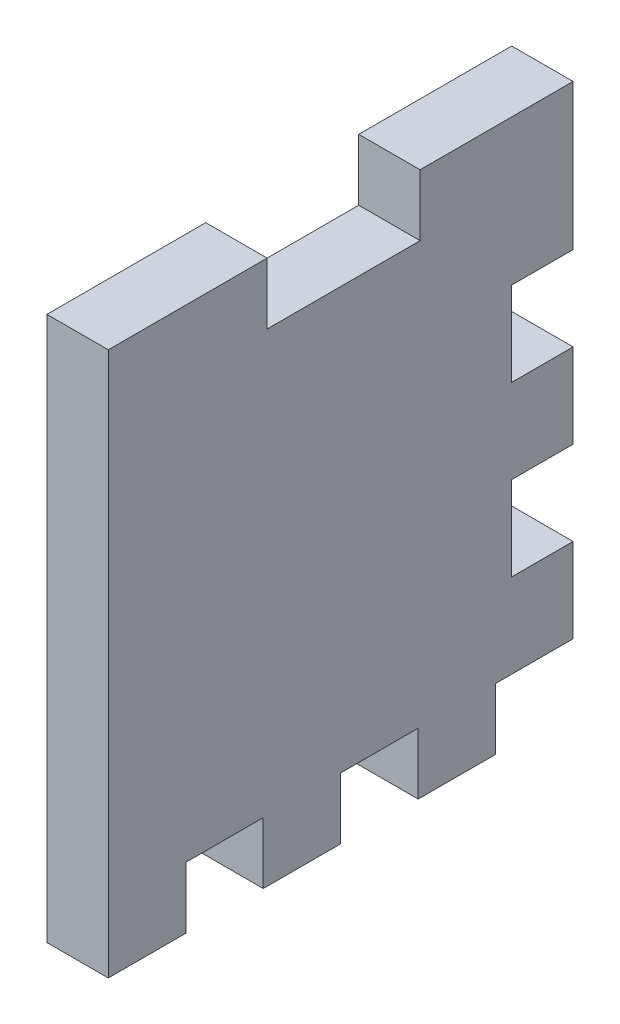
ISO-10303-21;
HEADER;
FILE_DESCRIPTION(('STEP AP214'),'2;1');
FILE_NAME('part.step','',(''),(''),'','','');
FILE_SCHEMA(('AUTOMOTIVE_DESIGN { 1 0 10303 214 1 1 1 1 }'));
ENDSEC;
DATA;
#1=APPLICATION_CONTEXT('core data for automotive mechanical design processes');
#2=APPLICATION_PROTOCOL_DEFINITION('international standard','automotive_design',2000,#1);
#3=PRODUCT_CONTEXT('',#1,'mechanical');
#4=PRODUCT('Part','Part','',(#3));
#5=PRODUCT_RELATED_PRODUCT_CATEGORY('part','',(#4));
#6=PRODUCT_DEFINITION_FORMATION('','',#4);
#7=PRODUCT_DEFINITION_CONTEXT('part definition',#1,'design');
#8=PRODUCT_DEFINITION('design','',#6,#7);
#9=PRODUCT_DEFINITION_SHAPE('','',#8);
#10=(LENGTH_UNIT() NAMED_UNIT(*) SI_UNIT(.MILLI.,.METRE.));
#11=(NAMED_UNIT(*) PLANE_ANGLE_UNIT() SI_UNIT($,.RADIAN.));
#12=(NAMED_UNIT(*) SI_UNIT($,.STERADIAN.) SOLID_ANGLE_UNIT());
#13=UNCERTAINTY_MEASURE_WITH_UNIT(LENGTH_MEASURE(1.E-05),#10,'distance_accuracy_value','');
#14=(GEOMETRIC_REPRESENTATION_CONTEXT(3) GLOBAL_UNCERTAINTY_ASSIGNED_CONTEXT((#13)) GLOBAL_UNIT_ASSIGNED_CONTEXT((#10,
#11,#12)) REPRESENTATION_CONTEXT('',''));
#15=CARTESIAN_POINT('',(0.,0.,0.));
#16=DIRECTION('',(0.,0.,1.));
#17=DIRECTION('',(1.,0.,0.));
#18=AXIS2_PLACEMENT_3D('',#15,#16,#17);
#19=CARTESIAN_POINT('',(2.667,20.9677,20.193));
#20=DIRECTION('',(0.,-1.,0.));
#21=DIRECTION('',(0.,0.,-1.));
#22=AXIS2_PLACEMENT_3D('',#19,#20,#21);
#23=PLANE('',#22);
#24=DIRECTION('',(0.,0.,1.));
#25=VECTOR('',#24,1.);
#26=CARTESIAN_POINT('',(2.667,20.9677,20.193));
#27=LINE('',#26,#25);
#28=CARTESIAN_POINT('',(2.667,20.9677,6.39233333333333));
#29=VERTEX_POINT('',#28);
#30=CARTESIAN_POINT('',(2.667,20.9677,20.193));
#31=VERTEX_POINT('',#30);
#32=EDGE_CURVE('E37',#29,#31,#27,.T.);
#33=ORIENTED_EDGE('',*,*,#32,.F.);
#34=DIRECTION('',(1.,0.,0.));
#35=VECTOR('',#34,1.);
#36=CARTESIAN_POINT('',(2.667,20.9677,6.39233333333333));
#37=LINE('',#36,#35);
#38=CARTESIAN_POINT('',(-2.667,20.9677,6.39233333333333));
#39=VERTEX_POINT('',#38);
#40=EDGE_CURVE('E227',#39,#29,#37,.T.);
#41=ORIENTED_EDGE('',*,*,#40,.F.);
#42=DIRECTION('',(0.,0.,1.));
#43=VECTOR('',#42,1.);
#44=CARTESIAN_POINT('',(-2.667,20.9677,20.193));
#45=LINE('',#44,#43);
#46=CARTESIAN_POINT('',(-2.667,20.9677,20.193));
#47=VERTEX_POINT('',#46);
#48=EDGE_CURVE('E422',#39,#47,#45,.T.);
#49=ORIENTED_EDGE('',*,*,#48,.T.);
#50=DIRECTION('',(-1.,0.,0.));
#51=VECTOR('',#50,1.);
#52=CARTESIAN_POINT('',(2.667,20.9677,20.193));
#53=LINE('',#52,#51);
#54=EDGE_CURVE('E43',#31,#47,#53,.T.);
#55=ORIENTED_EDGE('',*,*,#54,.F.);
#56=EDGE_LOOP('',(#33,#41,#49,#55));
#57=FACE_BOUND('',#56,.T.);
#58=ADVANCED_FACE('F33',(#57),#23,.F.);
#59=CARTESIAN_POINT('',(2.667,-20.9677,-20.193));
#60=DIRECTION('',(0.,0.,1.));
#61=DIRECTION('',(1.,0.,0.));
#62=AXIS2_PLACEMENT_3D('',#59,#60,#61);
#63=PLANE('',#62);
#64=DIRECTION('',(0.,1.,0.));
#65=VECTOR('',#64,1.);
#66=CARTESIAN_POINT('',(-2.667,-20.9677,-20.193));
#67=LINE('',#66,#65);
#68=CARTESIAN_POINT('',(-2.66699999999999,-6.32714000000001,-20.193));
#69=VERTEX_POINT('',#68);
#70=CARTESIAN_POINT('',(-2.667,0.993139999999993,-20.193));
#71=VERTEX_POINT('',#70);
#72=EDGE_CURVE('E423',#69,#71,#67,.T.);
#73=ORIENTED_EDGE('',*,*,#72,.T.);
#74=DIRECTION('',(1.,0.,0.));
#75=VECTOR('',#74,1.);
#76=CARTESIAN_POINT('',(2.667,0.993139999999994,-20.193));
#77=LINE('',#76,#75);
#78=CARTESIAN_POINT('',(2.667,0.993139999999994,-20.193));
#79=VERTEX_POINT('',#78);
#80=EDGE_CURVE('E293',#71,#79,#77,.T.);
#81=ORIENTED_EDGE('',*,*,#80,.T.);
#82=DIRECTION('',(0.,1.,0.));
#83=VECTOR('',#82,1.);
#84=CARTESIAN_POINT('',(2.667,-20.9677,-20.193));
#85=LINE('',#84,#83);
#86=CARTESIAN_POINT('',(2.66700000000001,-6.32714,-20.193));
#87=VERTEX_POINT('',#86);
#88=EDGE_CURVE('E412',#87,#79,#85,.T.);
#89=ORIENTED_EDGE('',*,*,#88,.F.);
#90=DIRECTION('',(-1.,0.,0.));
#91=VECTOR('',#90,1.);
#92=CARTESIAN_POINT('',(2.667,-6.32714,-20.193));
#93=LINE('',#92,#91);
#94=EDGE_CURVE('E254',#87,#69,#93,.T.);
#95=ORIENTED_EDGE('',*,*,#94,.T.);
#96=EDGE_LOOP('',(#73,#81,#89,#95));
#97=FACE_BOUND('',#96,.T.);
#98=ADVANCED_FACE('F471',(#97),#63,.F.);
#99=CARTESIAN_POINT('',(-2.667,-20.9677,-20.193));
#100=VERTEX_POINT('',#99);
#101=CARTESIAN_POINT('',(-2.66699999999999,-13.64742,-20.193));
#102=VERTEX_POINT('',#101);
#103=EDGE_CURVE('E418',#100,#102,#67,.T.);
#104=ORIENTED_EDGE('',*,*,#103,.T.);
#105=DIRECTION('',(1.,0.,0.));
#106=VECTOR('',#105,1.);
#107=CARTESIAN_POINT('',(2.667,-13.64742,-20.193));
#108=LINE('',#107,#106);
#109=CARTESIAN_POINT('',(2.667,-13.64742,-20.193));
#110=VERTEX_POINT('',#109);
#111=EDGE_CURVE('E257',#102,#110,#108,.T.);
#112=ORIENTED_EDGE('',*,*,#111,.T.);
#113=CARTESIAN_POINT('',(2.667,-20.9677,-20.193));
#114=VERTEX_POINT('',#113);
#115=EDGE_CURVE('E449',#114,#110,#85,.T.);
#116=ORIENTED_EDGE('',*,*,#115,.F.);
#117=DIRECTION('',(-1.,0.,0.));
#118=VECTOR('',#117,1.);
#119=CARTESIAN_POINT('',(2.667,-20.9677,-20.193));
#120=LINE('',#119,#118);
#121=EDGE_CURVE('E404',#114,#100,#120,.T.);
#122=ORIENTED_EDGE('',*,*,#121,.T.);
#123=EDGE_LOOP('',(#104,#112,#116,#122));
#124=FACE_BOUND('',#123,.T.);
#125=ADVANCED_FACE('F477',(#124),#63,.F.);
#126=CARTESIAN_POINT('',(2.667,-20.9677,20.193));
#127=DIRECTION('',(0.,1.,0.));
#128=DIRECTION('',(0.,0.,1.));
#129=AXIS2_PLACEMENT_3D('',#126,#127,#128);
#130=PLANE('',#129);
#131=DIRECTION('',(0.,0.,-1.));
#132=VECTOR('',#131,1.);
#133=CARTESIAN_POINT('',(-2.667,-20.9677,20.193));
#134=LINE('',#133,#132);
#135=CARTESIAN_POINT('',(-2.667,-20.9677,0.));
#136=VERTEX_POINT('',#135);
#137=CARTESIAN_POINT('',(-2.667,-20.9677,-6.731));
#138=VERTEX_POINT('',#137);
#139=EDGE_CURVE('E392',#136,#138,#134,.T.);
#140=ORIENTED_EDGE('',*,*,#139,.T.);
#141=DIRECTION('',(1.,0.,0.));
#142=VECTOR('',#141,1.);
#143=CARTESIAN_POINT('',(-2.667,-20.9677,-6.731));
#144=LINE('',#143,#142);
#145=CARTESIAN_POINT('',(2.667,-20.9677,-6.731));
#146=VERTEX_POINT('',#145);
#147=EDGE_CURVE('E327',#138,#146,#144,.T.);
#148=ORIENTED_EDGE('',*,*,#147,.T.);
#149=DIRECTION('',(0.,0.,-1.));
#150=VECTOR('',#149,1.);
#151=CARTESIAN_POINT('',(2.667,-20.9677,20.193));
#152=LINE('',#151,#150);
#153=CARTESIAN_POINT('',(2.667,-20.9677,0.));
#154=VERTEX_POINT('',#153);
#155=EDGE_CURVE('E397',#154,#146,#152,.T.);
#156=ORIENTED_EDGE('',*,*,#155,.F.);
#157=DIRECTION('',(1.,0.,0.));
#158=VECTOR('',#157,1.);
#159=CARTESIAN_POINT('',(-2.667,-20.9677,0.));
#160=LINE('',#159,#158);
#161=EDGE_CURVE('E357',#136,#154,#160,.T.);
#162=ORIENTED_EDGE('',*,*,#161,.F.);
#163=EDGE_LOOP('',(#140,#148,#156,#162));
#164=FACE_BOUND('',#163,.T.);
#165=ADVANCED_FACE('F493',(#164),#130,.F.);
#166=CARTESIAN_POINT('',(-2.667,-20.9677,13.462));
#167=VERTEX_POINT('',#166);
#168=CARTESIAN_POINT('',(-2.667,-20.9677,6.731));
#169=VERTEX_POINT('',#168);
#170=EDGE_CURVE('E395',#167,#169,#134,.T.);
#171=ORIENTED_EDGE('',*,*,#170,.T.);
#172=DIRECTION('',(1.,0.,0.));
#173=VECTOR('',#172,1.);
#174=CARTESIAN_POINT('',(-2.667,-20.9677,6.731));
#175=LINE('',#174,#173);
#176=CARTESIAN_POINT('',(2.667,-20.9677,6.731));
#177=VERTEX_POINT('',#176);
#178=EDGE_CURVE('E354',#169,#177,#175,.T.);
#179=ORIENTED_EDGE('',*,*,#178,.T.);
#180=CARTESIAN_POINT('',(2.667,-20.9677,13.462));
#181=VERTEX_POINT('',#180);
#182=EDGE_CURVE('E380',#181,#177,#152,.T.);
#183=ORIENTED_EDGE('',*,*,#182,.F.);
#184=DIRECTION('',(1.,0.,0.));
#185=VECTOR('',#184,1.);
#186=CARTESIAN_POINT('',(-2.667,-20.9677,13.462));
#187=LINE('',#186,#185);
#188=EDGE_CURVE('E375',#167,#181,#187,.T.);
#189=ORIENTED_EDGE('',*,*,#188,.F.);
#190=EDGE_LOOP('',(#171,#179,#183,#189));
#191=FACE_BOUND('',#190,.T.);
#192=ADVANCED_FACE('F490',(#191),#130,.F.);
#193=CARTESIAN_POINT('',(2.667,-20.9677,-13.462));
#194=VERTEX_POINT('',#193);
#195=EDGE_CURVE('E409',#194,#114,#152,.T.);
#196=ORIENTED_EDGE('',*,*,#195,.F.);
#197=DIRECTION('',(1.,0.,0.));
#198=VECTOR('',#197,1.);
#199=CARTESIAN_POINT('',(-2.667,-20.9677,-13.462));
#200=LINE('',#199,#198);
#201=CARTESIAN_POINT('',(-2.667,-20.9677,-13.462));
#202=VERTEX_POINT('',#201);
#203=EDGE_CURVE('E330',#202,#194,#200,.T.);
#204=ORIENTED_EDGE('',*,*,#203,.F.);
#205=EDGE_CURVE('E396',#202,#100,#134,.T.);
#206=ORIENTED_EDGE('',*,*,#205,.T.);
#207=ORIENTED_EDGE('',*,*,#121,.F.);
#208=EDGE_LOOP('',(#196,#204,#206,#207));
#209=FACE_BOUND('',#208,.T.);
#210=ADVANCED_FACE('F485',(#209),#130,.F.);
#211=CARTESIAN_POINT('',(2.667,8.31342,-20.193));
#212=VERTEX_POINT('',#211);
#213=CARTESIAN_POINT('',(2.667,20.9677,-20.193));
#214=VERTEX_POINT('',#213);
#215=EDGE_CURVE('E454',#212,#214,#85,.T.);
#216=ORIENTED_EDGE('',*,*,#215,.F.);
#217=DIRECTION('',(-1.,0.,0.));
#218=VECTOR('',#217,1.);
#219=CARTESIAN_POINT('',(2.667,8.31342,-20.193));
#220=LINE('',#219,#218);
#221=CARTESIAN_POINT('',(-2.667,8.31342,-20.193));
#222=VERTEX_POINT('',#221);
#223=EDGE_CURVE('E297',#212,#222,#220,.T.);
#224=ORIENTED_EDGE('',*,*,#223,.T.);
#225=CARTESIAN_POINT('',(-2.667,20.9677,-20.193));
#226=VERTEX_POINT('',#225);
#227=EDGE_CURVE('E379',#222,#226,#67,.T.);
#228=ORIENTED_EDGE('',*,*,#227,.T.);
#229=DIRECTION('',(-1.,0.,0.));
#230=VECTOR('',#229,1.);
#231=CARTESIAN_POINT('',(2.667,20.9677,-20.193));
#232=LINE('',#231,#230);
#233=EDGE_CURVE('E11',#214,#226,#232,.T.);
#234=ORIENTED_EDGE('',*,*,#233,.F.);
#235=EDGE_LOOP('',(#216,#224,#228,#234));
#236=FACE_BOUND('',#235,.T.);
#237=ADVANCED_FACE('F35',(#236),#63,.F.);
#238=CARTESIAN_POINT('',(-2.667,20.9677,-6.90033333333333));
#239=VERTEX_POINT('',#238);
#240=EDGE_CURVE('E424',#226,#239,#45,.T.);
#241=ORIENTED_EDGE('',*,*,#240,.T.);
#242=DIRECTION('',(-1.,0.,0.));
#243=VECTOR('',#242,1.);
#244=CARTESIAN_POINT('',(2.667,20.9677,-6.90033333333333));
#245=LINE('',#244,#243);
#246=CARTESIAN_POINT('',(2.667,20.9677,-6.90033333333333));
#247=VERTEX_POINT('',#246);
#248=EDGE_CURVE('E51',#247,#239,#245,.T.);
#249=ORIENTED_EDGE('',*,*,#248,.F.);
#250=EDGE_CURVE('E232',#214,#247,#27,.T.);
#251=ORIENTED_EDGE('',*,*,#250,.F.);
#252=ORIENTED_EDGE('',*,*,#233,.T.);
#253=EDGE_LOOP('',(#241,#249,#251,#252));
#254=FACE_BOUND('',#253,.T.);
#255=ADVANCED_FACE('F472',(#254),#23,.F.);
#256=CARTESIAN_POINT('',(2.667,-20.9677,20.193));
#257=DIRECTION('',(0.,0.,-1.));
#258=DIRECTION('',(-1.,0.,0.));
#259=AXIS2_PLACEMENT_3D('',#256,#257,#258);
#260=PLANE('',#259);
#261=DIRECTION('',(0.,-1.,0.));
#262=VECTOR('',#261,1.);
#263=CARTESIAN_POINT('',(-2.667,-20.9677,20.193));
#264=LINE('',#263,#262);
#265=CARTESIAN_POINT('',(-2.667,-26.3017,20.193));
#266=VERTEX_POINT('',#265);
#267=EDGE_CURVE('E402',#47,#266,#264,.T.);
#268=ORIENTED_EDGE('',*,*,#267,.T.);
#269=DIRECTION('',(1.,0.,0.));
#270=VECTOR('',#269,1.);
#271=CARTESIAN_POINT('',(-2.667,-26.3017,20.193));
#272=LINE('',#271,#270);
#273=CARTESIAN_POINT('',(2.667,-26.3017,20.193));
#274=VERTEX_POINT('',#273);
#275=EDGE_CURVE('E389',#266,#274,#272,.T.);
#276=ORIENTED_EDGE('',*,*,#275,.T.);
#277=DIRECTION('',(0.,-1.,0.));
#278=VECTOR('',#277,1.);
#279=CARTESIAN_POINT('',(2.667,-20.9677,20.193));
#280=LINE('',#279,#278);
#281=EDGE_CURVE('E411',#31,#274,#280,.T.);
#282=ORIENTED_EDGE('',*,*,#281,.F.);
#283=ORIENTED_EDGE('',*,*,#54,.T.);
#284=EDGE_LOOP('',(#268,#276,#282,#283));
#285=FACE_BOUND('',#284,.T.);
#286=ADVANCED_FACE('F438',(#285),#260,.F.);
#287=CARTESIAN_POINT('',(2.667,20.9677,-20.193));
#288=DIRECTION('',(-1.,0.,0.));
#289=DIRECTION('',(0.,0.,1.));
#290=AXIS2_PLACEMENT_3D('',#287,#288,#289);
#291=PLANE('',#290);
#292=ORIENTED_EDGE('',*,*,#32,.T.);
#293=ORIENTED_EDGE('',*,*,#281,.T.);
#294=DIRECTION('',(0.,0.,-1.));
#295=VECTOR('',#294,1.);
#296=CARTESIAN_POINT('',(2.667,-26.3017,20.193));
#297=LINE('',#296,#295);
#298=CARTESIAN_POINT('',(2.667,-26.3017,13.462));
#299=VERTEX_POINT('',#298);
#300=EDGE_CURVE('E356',#274,#299,#297,.T.);
#301=ORIENTED_EDGE('',*,*,#300,.T.);
#302=DIRECTION('',(0.,1.,0.));
#303=VECTOR('',#302,1.);
#304=CARTESIAN_POINT('',(2.667,-20.9677,13.462));
#305=LINE('',#304,#303);
#306=EDGE_CURVE('E367',#299,#181,#305,.T.);
#307=ORIENTED_EDGE('',*,*,#306,.T.);
#308=ORIENTED_EDGE('',*,*,#182,.T.);
#309=DIRECTION('',(0.,-1.,0.));
#310=VECTOR('',#309,1.);
#311=CARTESIAN_POINT('',(2.667,-20.9677,6.731));
#312=LINE('',#311,#310);
#313=CARTESIAN_POINT('',(2.667,-26.3017,6.731));
#314=VERTEX_POINT('',#313);
#315=EDGE_CURVE('E329',#177,#314,#312,.T.);
#316=ORIENTED_EDGE('',*,*,#315,.T.);
#317=DIRECTION('',(0.,0.,-1.));
#318=VECTOR('',#317,1.);
#319=CARTESIAN_POINT('',(2.667,-26.3017,6.731));
#320=LINE('',#319,#318);
#321=CARTESIAN_POINT('',(2.667,-26.3017,0.));
#322=VERTEX_POINT('',#321);
#323=EDGE_CURVE('E349',#314,#322,#320,.T.);
#324=ORIENTED_EDGE('',*,*,#323,.T.);
#325=DIRECTION('',(0.,1.,0.));
#326=VECTOR('',#325,1.);
#327=CARTESIAN_POINT('',(2.667,-20.9677,0.));
#328=LINE('',#327,#326);
#329=EDGE_CURVE('E340',#322,#154,#328,.T.);
#330=ORIENTED_EDGE('',*,*,#329,.T.);
#331=ORIENTED_EDGE('',*,*,#155,.T.);
#332=DIRECTION('',(0.,-1.,0.));
#333=VECTOR('',#332,1.);
#334=CARTESIAN_POINT('',(2.667,-20.9677,-6.731));
#335=LINE('',#334,#333);
#336=CARTESIAN_POINT('',(2.667,-26.3017,-6.731));
#337=VERTEX_POINT('',#336);
#338=EDGE_CURVE('E308',#146,#337,#335,.T.);
#339=ORIENTED_EDGE('',*,*,#338,.T.);
#340=DIRECTION('',(0.,0.,-1.));
#341=VECTOR('',#340,1.);
#342=CARTESIAN_POINT('',(2.667,-26.3017,-6.731));
#343=LINE('',#342,#341);
#344=CARTESIAN_POINT('',(2.667,-26.3017,-13.462));
#345=VERTEX_POINT('',#344);
#346=EDGE_CURVE('E322',#337,#345,#343,.T.);
#347=ORIENTED_EDGE('',*,*,#346,.T.);
#348=DIRECTION('',(0.,1.,0.));
#349=VECTOR('',#348,1.);
#350=CARTESIAN_POINT('',(2.667,-20.9677,-13.462));
#351=LINE('',#350,#349);
#352=EDGE_CURVE('E313',#345,#194,#351,.T.);
#353=ORIENTED_EDGE('',*,*,#352,.T.);
#354=ORIENTED_EDGE('',*,*,#195,.T.);
#355=ORIENTED_EDGE('',*,*,#115,.T.);
#356=DIRECTION('',(0.,0.,1.));
#357=VECTOR('',#356,1.);
#358=CARTESIAN_POINT('',(2.667,-13.64742,-20.193));
#359=LINE('',#358,#357);
#360=CARTESIAN_POINT('',(2.667,-13.64742,-14.859));
#361=VERTEX_POINT('',#360);
#362=EDGE_CURVE('E268',#110,#361,#359,.T.);
#363=ORIENTED_EDGE('',*,*,#362,.T.);
#364=DIRECTION('',(0.,-1.,0.));
#365=VECTOR('',#364,1.);
#366=CARTESIAN_POINT('',(2.667,20.9677,-14.859));
#367=LINE('',#366,#365);
#368=CARTESIAN_POINT('',(2.66700000000001,-6.32714,-14.859));
#369=VERTEX_POINT('',#368);
#370=EDGE_CURVE('E290',#369,#361,#367,.T.);
#371=ORIENTED_EDGE('',*,*,#370,.F.);
#372=DIRECTION('',(0.,0.,1.));
#373=VECTOR('',#372,1.);
#374=CARTESIAN_POINT('',(2.667,-6.32714,-20.193));
#375=LINE('',#374,#373);
#376=EDGE_CURVE('E261',#87,#369,#375,.T.);
#377=ORIENTED_EDGE('',*,*,#376,.F.);
#378=ORIENTED_EDGE('',*,*,#88,.T.);
#379=DIRECTION('',(0.,0.,1.));
#380=VECTOR('',#379,1.);
#381=CARTESIAN_POINT('',(2.667,0.993139999999994,-20.193));
#382=LINE('',#381,#380);
#383=CARTESIAN_POINT('',(2.667,0.993139999999994,-14.859));
#384=VERTEX_POINT('',#383);
#385=EDGE_CURVE('E286',#79,#384,#382,.T.);
#386=ORIENTED_EDGE('',*,*,#385,.T.);
#387=CARTESIAN_POINT('',(2.667,8.31342,-14.859));
#388=VERTEX_POINT('',#387);
#389=EDGE_CURVE('E306',#388,#384,#367,.T.);
#390=ORIENTED_EDGE('',*,*,#389,.F.);
#391=DIRECTION('',(0.,0.,1.));
#392=VECTOR('',#391,1.);
#393=CARTESIAN_POINT('',(2.667,8.31342,-20.193));
#394=LINE('',#393,#392);
#395=EDGE_CURVE('E296',#212,#388,#394,.T.);
#396=ORIENTED_EDGE('',*,*,#395,.F.);
#397=ORIENTED_EDGE('',*,*,#215,.T.);
#398=ORIENTED_EDGE('',*,*,#250,.T.);
#399=DIRECTION('',(0.,1.,0.));
#400=VECTOR('',#399,1.);
#401=CARTESIAN_POINT('',(2.667,15.6337,-6.90033333333333));
#402=LINE('',#401,#400);
#403=CARTESIAN_POINT('',(2.667,15.6337,-6.90033333333333));
#404=VERTEX_POINT('',#403);
#405=EDGE_CURVE('E224',#404,#247,#402,.T.);
#406=ORIENTED_EDGE('',*,*,#405,.F.);
#407=DIRECTION('',(0.,0.,1.));
#408=VECTOR('',#407,1.);
#409=CARTESIAN_POINT('',(2.667,15.6337,-20.193));
#410=LINE('',#409,#408);
#411=CARTESIAN_POINT('',(2.667,15.6337,6.39233333333333));
#412=VERTEX_POINT('',#411);
#413=EDGE_CURVE('E209',#404,#412,#410,.T.);
#414=ORIENTED_EDGE('',*,*,#413,.T.);
#415=DIRECTION('',(0.,1.,0.));
#416=VECTOR('',#415,1.);
#417=CARTESIAN_POINT('',(2.667,15.6337,6.39233333333333));
#418=LINE('',#417,#416);
#419=EDGE_CURVE('E221',#412,#29,#418,.T.);
#420=ORIENTED_EDGE('',*,*,#419,.T.);
#421=EDGE_LOOP('',(#292,#293,#301,#307,#308,#316,#324,#330,#331,#339,#347,#353,#354,#355,#363,
#371,#377,#378,#386,#390,#396,#397,#398,#406,#414,#420));
#422=FACE_BOUND('',#421,.T.);
#423=ADVANCED_FACE('F230',(#422),#291,.F.);
#424=CARTESIAN_POINT('',(-2.667,20.9677,-20.193));
#425=DIRECTION('',(-1.,0.,0.));
#426=DIRECTION('',(0.,0.,1.));
#427=AXIS2_PLACEMENT_3D('',#424,#425,#426);
#428=PLANE('',#427);
#429=DIRECTION('',(0.,1.,0.));
#430=VECTOR('',#429,1.);
#431=CARTESIAN_POINT('',(-2.667,15.6337,6.39233333333333));
#432=LINE('',#431,#430);
#433=CARTESIAN_POINT('',(-2.667,15.6337,6.39233333333333));
#434=VERTEX_POINT('',#433);
#435=EDGE_CURVE('E234',#434,#39,#432,.T.);
#436=ORIENTED_EDGE('',*,*,#435,.F.);
#437=DIRECTION('',(0.,0.,1.));
#438=VECTOR('',#437,1.);
#439=CARTESIAN_POINT('',(-2.667,15.6337,-6.90033333333333));
#440=LINE('',#439,#438);
#441=CARTESIAN_POINT('',(-2.667,15.6337,-6.90033333333333));
#442=VERTEX_POINT('',#441);
#443=EDGE_CURVE('E226',#442,#434,#440,.T.);
#444=ORIENTED_EDGE('',*,*,#443,.F.);
#445=DIRECTION('',(0.,1.,0.));
#446=VECTOR('',#445,1.);
#447=CARTESIAN_POINT('',(-2.667,15.6337,-6.90033333333333));
#448=LINE('',#447,#446);
#449=EDGE_CURVE('E225',#442,#239,#448,.T.);
#450=ORIENTED_EDGE('',*,*,#449,.T.);
#451=ORIENTED_EDGE('',*,*,#240,.F.);
#452=ORIENTED_EDGE('',*,*,#227,.F.);
#453=DIRECTION('',(0.,0.,1.));
#454=VECTOR('',#453,1.);
#455=CARTESIAN_POINT('',(-2.667,8.31342,-20.193));
#456=LINE('',#455,#454);
#457=CARTESIAN_POINT('',(-2.667,8.31342,-14.859));
#458=VERTEX_POINT('',#457);
#459=EDGE_CURVE('E797',#222,#458,#456,.T.);
#460=ORIENTED_EDGE('',*,*,#459,.T.);
#461=DIRECTION('',(0.,-1.,0.));
#462=VECTOR('',#461,1.);
#463=CARTESIAN_POINT('',(-2.667,8.31342,-14.859));
#464=LINE('',#463,#462);
#465=CARTESIAN_POINT('',(-2.667,0.993139999999993,-14.859));
#466=VERTEX_POINT('',#465);
#467=EDGE_CURVE('E277',#458,#466,#464,.T.);
#468=ORIENTED_EDGE('',*,*,#467,.T.);
#469=DIRECTION('',(0.,0.,1.));
#470=VECTOR('',#469,1.);
#471=CARTESIAN_POINT('',(-2.667,0.993139999999993,-20.193));
#472=LINE('',#471,#470);
#473=EDGE_CURVE('E283',#71,#466,#472,.T.);
#474=ORIENTED_EDGE('',*,*,#473,.F.);
#475=ORIENTED_EDGE('',*,*,#72,.F.);
#476=DIRECTION('',(0.,0.,1.));
#477=VECTOR('',#476,1.);
#478=CARTESIAN_POINT('',(-2.66699999999999,-6.32714000000001,-20.193));
#479=LINE('',#478,#477);
#480=CARTESIAN_POINT('',(-2.667,-6.32714,-14.859));
#481=VERTEX_POINT('',#480);
#482=EDGE_CURVE('E273',#69,#481,#479,.T.);
#483=ORIENTED_EDGE('',*,*,#482,.T.);
#484=DIRECTION('',(0.,-1.,0.));
#485=VECTOR('',#484,1.);
#486=CARTESIAN_POINT('',(-2.66699999999999,-13.64742,-14.859));
#487=LINE('',#486,#485);
#488=CARTESIAN_POINT('',(-2.66699999999999,-13.64742,-14.859));
#489=VERTEX_POINT('',#488);
#490=EDGE_CURVE('E263',#481,#489,#487,.T.);
#491=ORIENTED_EDGE('',*,*,#490,.T.);
#492=DIRECTION('',(0.,0.,1.));
#493=VECTOR('',#492,1.);
#494=CARTESIAN_POINT('',(-2.66699999999999,-13.64742,-20.193));
#495=LINE('',#494,#493);
#496=EDGE_CURVE('E271',#102,#489,#495,.T.);
#497=ORIENTED_EDGE('',*,*,#496,.F.);
#498=ORIENTED_EDGE('',*,*,#103,.F.);
#499=ORIENTED_EDGE('',*,*,#205,.F.);
#500=DIRECTION('',(0.,1.,0.));
#501=VECTOR('',#500,1.);
#502=CARTESIAN_POINT('',(-2.667,-20.9677,-13.462));
#503=LINE('',#502,#501);
#504=CARTESIAN_POINT('',(-2.667,-26.3017,-13.462));
#505=VERTEX_POINT('',#504);
#506=EDGE_CURVE('E316',#505,#202,#503,.T.);
#507=ORIENTED_EDGE('',*,*,#506,.F.);
#508=DIRECTION('',(0.,0.,-1.));
#509=VECTOR('',#508,1.);
#510=CARTESIAN_POINT('',(-2.667,-26.3017,-6.731));
#511=LINE('',#510,#509);
#512=CARTESIAN_POINT('',(-2.667,-26.3017,-6.731));
#513=VERTEX_POINT('',#512);
#514=EDGE_CURVE('E312',#513,#505,#511,.T.);
#515=ORIENTED_EDGE('',*,*,#514,.F.);
#516=DIRECTION('',(0.,-1.,0.));
#517=VECTOR('',#516,1.);
#518=CARTESIAN_POINT('',(-2.667,-20.9677,-6.731));
#519=LINE('',#518,#517);
#520=EDGE_CURVE('E309',#138,#513,#519,.T.);
#521=ORIENTED_EDGE('',*,*,#520,.F.);
#522=ORIENTED_EDGE('',*,*,#139,.F.);
#523=DIRECTION('',(0.,1.,0.));
#524=VECTOR('',#523,1.);
#525=CARTESIAN_POINT('',(-2.667,-20.9677,0.));
#526=LINE('',#525,#524);
#527=CARTESIAN_POINT('',(-2.667,-26.3017,0.));
#528=VERTEX_POINT('',#527);
#529=EDGE_CURVE('E343',#528,#136,#526,.T.);
#530=ORIENTED_EDGE('',*,*,#529,.F.);
#531=DIRECTION('',(0.,0.,-1.));
#532=VECTOR('',#531,1.);
#533=CARTESIAN_POINT('',(-2.667,-26.3017,6.731));
#534=LINE('',#533,#532);
#535=CARTESIAN_POINT('',(-2.667,-26.3017,6.731));
#536=VERTEX_POINT('',#535);
#537=EDGE_CURVE('E339',#536,#528,#534,.T.);
#538=ORIENTED_EDGE('',*,*,#537,.F.);
#539=DIRECTION('',(0.,-1.,0.));
#540=VECTOR('',#539,1.);
#541=CARTESIAN_POINT('',(-2.667,-20.9677,6.731));
#542=LINE('',#541,#540);
#543=EDGE_CURVE('E336',#169,#536,#542,.T.);
#544=ORIENTED_EDGE('',*,*,#543,.F.);
#545=ORIENTED_EDGE('',*,*,#170,.F.);
#546=DIRECTION('',(0.,1.,0.));
#547=VECTOR('',#546,1.);
#548=CARTESIAN_POINT('',(-2.667,-20.9677,13.462));
#549=LINE('',#548,#547);
#550=CARTESIAN_POINT('',(-2.667,-26.3017,13.462));
#551=VERTEX_POINT('',#550);
#552=EDGE_CURVE('E366',#551,#167,#549,.T.);
#553=ORIENTED_EDGE('',*,*,#552,.F.);
#554=DIRECTION('',(0.,0.,-1.));
#555=VECTOR('',#554,1.);
#556=CARTESIAN_POINT('',(-2.667,-26.3017,20.193));
#557=LINE('',#556,#555);
#558=EDGE_CURVE('E363',#266,#551,#557,.T.);
#559=ORIENTED_EDGE('',*,*,#558,.F.);
#560=ORIENTED_EDGE('',*,*,#267,.F.);
#561=ORIENTED_EDGE('',*,*,#48,.F.);
#562=EDGE_LOOP('',(#436,#444,#450,#451,#452,#460,#468,#474,#475,#483,#491,#497,#498,#499,#507,
#515,#521,#522,#530,#538,#544,#545,#553,#559,#560,#561));
#563=FACE_BOUND('',#562,.T.);
#564=ADVANCED_FACE('F442',(#563),#428,.T.);
#565=CARTESIAN_POINT('',(-2.667,-20.9677,13.462));
#566=DIRECTION('',(0.,0.,-1.));
#567=DIRECTION('',(-1.,0.,0.));
#568=AXIS2_PLACEMENT_3D('',#565,#566,#567);
#569=PLANE('',#568);
#570=ORIENTED_EDGE('',*,*,#306,.F.);
#571=DIRECTION('',(1.,0.,0.));
#572=VECTOR('',#571,1.);
#573=CARTESIAN_POINT('',(-2.667,-26.3017,13.462));
#574=LINE('',#573,#572);
#575=EDGE_CURVE('E372',#551,#299,#574,.T.);
#576=ORIENTED_EDGE('',*,*,#575,.F.);
#577=ORIENTED_EDGE('',*,*,#552,.T.);
#578=ORIENTED_EDGE('',*,*,#188,.T.);
#579=EDGE_LOOP('',(#570,#576,#577,#578));
#580=FACE_BOUND('',#579,.T.);
#581=ADVANCED_FACE('F549',(#580),#569,.T.);
#582=CARTESIAN_POINT('',(-2.667,-26.3017,20.193));
#583=DIRECTION('',(0.,-1.,0.));
#584=DIRECTION('',(0.,0.,-1.));
#585=AXIS2_PLACEMENT_3D('',#582,#583,#584);
#586=PLANE('',#585);
#587=ORIENTED_EDGE('',*,*,#300,.F.);
#588=ORIENTED_EDGE('',*,*,#275,.F.);
#589=ORIENTED_EDGE('',*,*,#558,.T.);
#590=ORIENTED_EDGE('',*,*,#575,.T.);
#591=EDGE_LOOP('',(#587,#588,#589,#590));
#592=FACE_BOUND('',#591,.T.);
#593=ADVANCED_FACE('F447',(#592),#586,.T.);
#594=CARTESIAN_POINT('',(-2.667,-20.9677,6.731));
#595=DIRECTION('',(0.,0.,1.));
#596=DIRECTION('',(0.,-1.,0.));
#597=AXIS2_PLACEMENT_3D('',#594,#595,#596);
#598=PLANE('',#597);
#599=ORIENTED_EDGE('',*,*,#315,.F.);
#600=ORIENTED_EDGE('',*,*,#178,.F.);
#601=ORIENTED_EDGE('',*,*,#543,.T.);
#602=DIRECTION('',(1.,0.,0.));
#603=VECTOR('',#602,1.);
#604=CARTESIAN_POINT('',(-2.667,-26.3017,6.731));
#605=LINE('',#604,#603);
#606=EDGE_CURVE('E346',#536,#314,#605,.T.);
#607=ORIENTED_EDGE('',*,*,#606,.T.);
#608=EDGE_LOOP('',(#599,#600,#601,#607));
#609=FACE_BOUND('',#608,.T.);
#610=ADVANCED_FACE('F546',(#609),#598,.T.);
#611=CARTESIAN_POINT('',(-2.667,-20.9677,0.));
#612=DIRECTION('',(0.,0.,-1.));
#613=DIRECTION('',(0.,1.,0.));
#614=AXIS2_PLACEMENT_3D('',#611,#612,#613);
#615=PLANE('',#614);
#616=ORIENTED_EDGE('',*,*,#329,.F.);
#617=DIRECTION('',(1.,0.,0.));
#618=VECTOR('',#617,1.);
#619=CARTESIAN_POINT('',(-2.667,-26.3017,0.));
#620=LINE('',#619,#618);
#621=EDGE_CURVE('E360',#528,#322,#620,.T.);
#622=ORIENTED_EDGE('',*,*,#621,.F.);
#623=ORIENTED_EDGE('',*,*,#529,.T.);
#624=ORIENTED_EDGE('',*,*,#161,.T.);
#625=EDGE_LOOP('',(#616,#622,#623,#624));
#626=FACE_BOUND('',#625,.T.);
#627=ADVANCED_FACE('F539',(#626),#615,.T.);
#628=CARTESIAN_POINT('',(-2.667,-26.3017,6.731));
#629=DIRECTION('',(0.,-1.,0.));
#630=DIRECTION('',(0.,0.,-1.));
#631=AXIS2_PLACEMENT_3D('',#628,#629,#630);
#632=PLANE('',#631);
#633=ORIENTED_EDGE('',*,*,#323,.F.);
#634=ORIENTED_EDGE('',*,*,#606,.F.);
#635=ORIENTED_EDGE('',*,*,#537,.T.);
#636=ORIENTED_EDGE('',*,*,#621,.T.);
#637=EDGE_LOOP('',(#633,#634,#635,#636));
#638=FACE_BOUND('',#637,.T.);
#639=ADVANCED_FACE('F542',(#638),#632,.T.);
#640=CARTESIAN_POINT('',(-2.667,-20.9677,-6.731));
#641=DIRECTION('',(0.,0.,1.));
#642=DIRECTION('',(0.,-1.,0.));
#643=AXIS2_PLACEMENT_3D('',#640,#641,#642);
#644=PLANE('',#643);
#645=ORIENTED_EDGE('',*,*,#338,.F.);
#646=ORIENTED_EDGE('',*,*,#147,.F.);
#647=ORIENTED_EDGE('',*,*,#520,.T.);
#648=DIRECTION('',(1.,0.,0.));
#649=VECTOR('',#648,1.);
#650=CARTESIAN_POINT('',(-2.667,-26.3017,-6.731));
#651=LINE('',#650,#649);
#652=EDGE_CURVE('E319',#513,#337,#651,.T.);
#653=ORIENTED_EDGE('',*,*,#652,.T.);
#654=EDGE_LOOP('',(#645,#646,#647,#653));
#655=FACE_BOUND('',#654,.T.);
#656=ADVANCED_FACE('F528',(#655),#644,.T.);
#657=CARTESIAN_POINT('',(-2.667,-20.9677,-13.462));
#658=DIRECTION('',(0.,0.,-1.));
#659=DIRECTION('',(-1.,0.,0.));
#660=AXIS2_PLACEMENT_3D('',#657,#658,#659);
#661=PLANE('',#660);
#662=ORIENTED_EDGE('',*,*,#352,.F.);
#663=DIRECTION('',(1.,0.,0.));
#664=VECTOR('',#663,1.);
#665=CARTESIAN_POINT('',(-2.667,-26.3017,-13.462));
#666=LINE('',#665,#664);
#667=EDGE_CURVE('E333',#505,#345,#666,.T.);
#668=ORIENTED_EDGE('',*,*,#667,.F.);
#669=ORIENTED_EDGE('',*,*,#506,.T.);
#670=ORIENTED_EDGE('',*,*,#203,.T.);
#671=EDGE_LOOP('',(#662,#668,#669,#670));
#672=FACE_BOUND('',#671,.T.);
#673=ADVANCED_FACE('F535',(#672),#661,.T.);
#674=CARTESIAN_POINT('',(-2.667,-26.3017,-6.731));
#675=DIRECTION('',(0.,-1.,0.));
#676=DIRECTION('',(0.,0.,-1.));
#677=AXIS2_PLACEMENT_3D('',#674,#675,#676);
#678=PLANE('',#677);
#679=ORIENTED_EDGE('',*,*,#346,.F.);
#680=ORIENTED_EDGE('',*,*,#652,.F.);
#681=ORIENTED_EDGE('',*,*,#514,.T.);
#682=ORIENTED_EDGE('',*,*,#667,.T.);
#683=EDGE_LOOP('',(#679,#680,#681,#682));
#684=FACE_BOUND('',#683,.T.);
#685=ADVANCED_FACE('F533',(#684),#678,.T.);
#686=CARTESIAN_POINT('',(2.667,-13.64742,-20.193));
#687=DIRECTION('',(0.,-1.,0.));
#688=DIRECTION('',(0.,0.,-1.));
#689=AXIS2_PLACEMENT_3D('',#686,#687,#688);
#690=PLANE('',#689);
#691=DIRECTION('',(1.,0.,0.));
#692=VECTOR('',#691,1.);
#693=CARTESIAN_POINT('',(2.667,-13.64742,-14.859));
#694=LINE('',#693,#692);
#695=EDGE_CURVE('E258',#489,#361,#694,.T.);
#696=ORIENTED_EDGE('',*,*,#695,.T.);
#697=ORIENTED_EDGE('',*,*,#362,.F.);
#698=ORIENTED_EDGE('',*,*,#111,.F.);
#699=ORIENTED_EDGE('',*,*,#496,.T.);
#700=EDGE_LOOP('',(#696,#697,#698,#699));
#701=FACE_BOUND('',#700,.T.);
#702=ADVANCED_FACE('F511',(#701),#690,.F.);
#703=CARTESIAN_POINT('',(2.667,-6.32714,-20.193));
#704=DIRECTION('',(0.,1.,0.));
#705=DIRECTION('',(-1.,0.,0.));
#706=AXIS2_PLACEMENT_3D('',#703,#704,#705);
#707=PLANE('',#706);
#708=DIRECTION('',(-1.,0.,0.));
#709=VECTOR('',#708,1.);
#710=CARTESIAN_POINT('',(2.667,-6.32714,-14.859));
#711=LINE('',#710,#709);
#712=EDGE_CURVE('E220',#369,#481,#711,.T.);
#713=ORIENTED_EDGE('',*,*,#712,.T.);
#714=ORIENTED_EDGE('',*,*,#482,.F.);
#715=ORIENTED_EDGE('',*,*,#94,.F.);
#716=ORIENTED_EDGE('',*,*,#376,.T.);
#717=EDGE_LOOP('',(#713,#714,#715,#716));
#718=FACE_BOUND('',#717,.T.);
#719=ADVANCED_FACE('F669',(#718),#707,.F.);
#720=CARTESIAN_POINT('',(50.165,15.6337,-14.859));
#721=DIRECTION('',(0.,0.,-1.));
#722=DIRECTION('',(-1.,0.,0.));
#723=AXIS2_PLACEMENT_3D('',#720,#721,#722);
#724=PLANE('',#723);
#725=ORIENTED_EDGE('',*,*,#370,.T.);
#726=ORIENTED_EDGE('',*,*,#695,.F.);
#727=ORIENTED_EDGE('',*,*,#490,.F.);
#728=ORIENTED_EDGE('',*,*,#712,.F.);
#729=EDGE_LOOP('',(#725,#726,#727,#728));
#730=FACE_BOUND('',#729,.T.);
#731=ADVANCED_FACE('F513',(#730),#724,.T.);
#732=ORIENTED_EDGE('',*,*,#389,.T.);
#733=DIRECTION('',(1.,0.,0.));
#734=VECTOR('',#733,1.);
#735=CARTESIAN_POINT('',(2.667,0.993139999999994,-14.859));
#736=LINE('',#735,#734);
#737=EDGE_CURVE('E280',#466,#384,#736,.T.);
#738=ORIENTED_EDGE('',*,*,#737,.F.);
#739=ORIENTED_EDGE('',*,*,#467,.F.);
#740=DIRECTION('',(-1.,0.,0.));
#741=VECTOR('',#740,1.);
#742=CARTESIAN_POINT('',(2.667,8.31342,-14.859));
#743=LINE('',#742,#741);
#744=EDGE_CURVE('E59',#388,#458,#743,.T.);
#745=ORIENTED_EDGE('',*,*,#744,.F.);
#746=EDGE_LOOP('',(#732,#738,#739,#745));
#747=FACE_BOUND('',#746,.T.);
#748=ADVANCED_FACE('F686',(#747),#724,.T.);
#749=CARTESIAN_POINT('',(2.667,0.993139999999994,-20.193));
#750=DIRECTION('',(0.,-1.,0.));
#751=DIRECTION('',(1.,0.,0.));
#752=AXIS2_PLACEMENT_3D('',#749,#750,#751);
#753=PLANE('',#752);
#754=ORIENTED_EDGE('',*,*,#737,.T.);
#755=ORIENTED_EDGE('',*,*,#385,.F.);
#756=ORIENTED_EDGE('',*,*,#80,.F.);
#757=ORIENTED_EDGE('',*,*,#473,.T.);
#758=EDGE_LOOP('',(#754,#755,#756,#757));
#759=FACE_BOUND('',#758,.T.);
#760=ADVANCED_FACE('F695',(#759),#753,.F.);
#761=CARTESIAN_POINT('',(2.667,8.31342,-20.193));
#762=DIRECTION('',(0.,1.,0.));
#763=DIRECTION('',(0.,0.,1.));
#764=AXIS2_PLACEMENT_3D('',#761,#762,#763);
#765=PLANE('',#764);
#766=ORIENTED_EDGE('',*,*,#744,.T.);
#767=ORIENTED_EDGE('',*,*,#459,.F.);
#768=ORIENTED_EDGE('',*,*,#223,.F.);
#769=ORIENTED_EDGE('',*,*,#395,.T.);
#770=EDGE_LOOP('',(#766,#767,#768,#769));
#771=FACE_BOUND('',#770,.T.);
#772=ADVANCED_FACE('F468',(#771),#765,.F.);
#773=CARTESIAN_POINT('',(50.165,15.6337,-20.193));
#774=DIRECTION('',(0.,-1.,0.));
#775=DIRECTION('',(0.,0.,-1.));
#776=AXIS2_PLACEMENT_3D('',#773,#774,#775);
#777=PLANE('',#776);
#778=DIRECTION('',(-1.,0.,0.));
#779=VECTOR('',#778,1.);
#780=CARTESIAN_POINT('',(2.667,15.6337,-6.90033333333333));
#781=LINE('',#780,#779);
#782=EDGE_CURVE('E212',#404,#442,#781,.T.);
#783=ORIENTED_EDGE('',*,*,#782,.T.);
#784=ORIENTED_EDGE('',*,*,#443,.T.);
#785=DIRECTION('',(1.,0.,0.));
#786=VECTOR('',#785,1.);
#787=CARTESIAN_POINT('',(2.667,15.6337,6.39233333333333));
#788=LINE('',#787,#786);
#789=EDGE_CURVE('E215',#434,#412,#788,.T.);
#790=ORIENTED_EDGE('',*,*,#789,.T.);
#791=ORIENTED_EDGE('',*,*,#413,.F.);
#792=EDGE_LOOP('',(#783,#784,#790,#791));
#793=FACE_BOUND('',#792,.T.);
#794=ADVANCED_FACE('F211',(#793),#777,.F.);
#795=CARTESIAN_POINT('',(2.667,15.6337,6.39233333333333));
#796=DIRECTION('',(0.,0.,1.));
#797=DIRECTION('',(1.,0.,0.));
#798=AXIS2_PLACEMENT_3D('',#795,#796,#797);
#799=PLANE('',#798);
#800=ORIENTED_EDGE('',*,*,#40,.T.);
#801=ORIENTED_EDGE('',*,*,#419,.F.);
#802=ORIENTED_EDGE('',*,*,#789,.F.);
#803=ORIENTED_EDGE('',*,*,#435,.T.);
#804=EDGE_LOOP('',(#800,#801,#802,#803));
#805=FACE_BOUND('',#804,.T.);
#806=ADVANCED_FACE('F460',(#805),#799,.F.);
#807=CARTESIAN_POINT('',(2.667,15.6337,-6.90033333333333));
#808=DIRECTION('',(0.,0.,-1.));
#809=DIRECTION('',(-1.,0.,0.));
#810=AXIS2_PLACEMENT_3D('',#807,#808,#809);
#811=PLANE('',#810);
#812=ORIENTED_EDGE('',*,*,#248,.T.);
#813=ORIENTED_EDGE('',*,*,#449,.F.);
#814=ORIENTED_EDGE('',*,*,#782,.F.);
#815=ORIENTED_EDGE('',*,*,#405,.T.);
#816=EDGE_LOOP('',(#812,#813,#814,#815));
#817=FACE_BOUND('',#816,.T.);
#818=ADVANCED_FACE('F223',(#817),#811,.F.);
#819=CLOSED_SHELL('',(#58,#98,#125,#165,#192,#210,#237,#255,#286,#423,#564,#581,#593,#610,#627,
#639,#656,#673,#685,#702,#719,#731,#748,#760,#772,#794,#806,#818));
#820=MANIFOLD_SOLID_BREP('B2',#819);
#821=ADVANCED_BREP_SHAPE_REPRESENTATION('',(#18,#820),#14);
#822=SHAPE_DEFINITION_REPRESENTATION(#9,#821);
ENDSEC;
END-ISO-10303-21;
